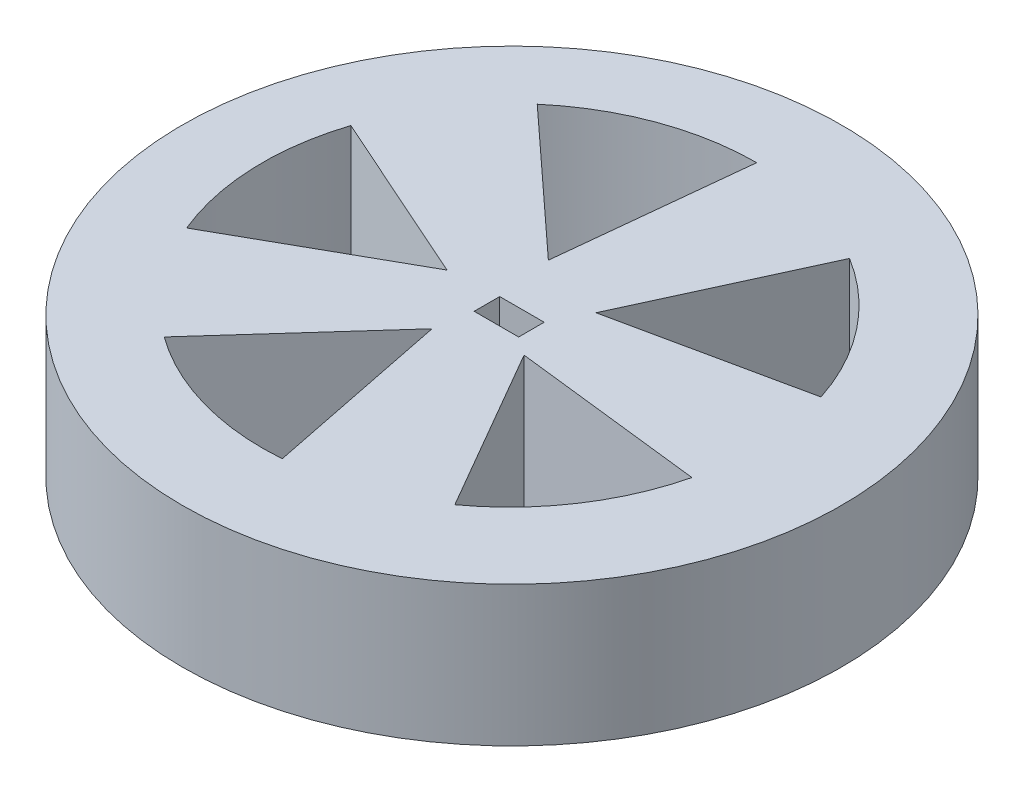
ISO-10303-21;
HEADER;
FILE_DESCRIPTION(('STEP AP214'),'2;1');
FILE_NAME('part.step','',(''),(''),'','','');
FILE_SCHEMA(('AUTOMOTIVE_DESIGN { 1 0 10303 214 1 1 1 1 }'));
ENDSEC;
DATA;
#1=APPLICATION_CONTEXT('core data for automotive mechanical design processes');
#2=APPLICATION_PROTOCOL_DEFINITION('international standard','automotive_design',2000,#1);
#3=PRODUCT_CONTEXT('',#1,'mechanical');
#4=PRODUCT('Part','Part','',(#3));
#5=PRODUCT_RELATED_PRODUCT_CATEGORY('part','',(#4));
#6=PRODUCT_DEFINITION_FORMATION('','',#4);
#7=PRODUCT_DEFINITION_CONTEXT('part definition',#1,'design');
#8=PRODUCT_DEFINITION('design','',#6,#7);
#9=PRODUCT_DEFINITION_SHAPE('','',#8);
#10=(LENGTH_UNIT() NAMED_UNIT(*) SI_UNIT(.MILLI.,.METRE.));
#11=(NAMED_UNIT(*) PLANE_ANGLE_UNIT() SI_UNIT($,.RADIAN.));
#12=(NAMED_UNIT(*) SI_UNIT($,.STERADIAN.) SOLID_ANGLE_UNIT());
#13=UNCERTAINTY_MEASURE_WITH_UNIT(LENGTH_MEASURE(1.E-05),#10,'distance_accuracy_value','');
#14=(GEOMETRIC_REPRESENTATION_CONTEXT(3) GLOBAL_UNCERTAINTY_ASSIGNED_CONTEXT((#13)) GLOBAL_UNIT_ASSIGNED_CONTEXT((#10,
#11,#12)) REPRESENTATION_CONTEXT('',''));
#15=CARTESIAN_POINT('',(0.,0.,0.));
#16=DIRECTION('',(0.,0.,1.));
#17=DIRECTION('',(1.,0.,0.));
#18=AXIS2_PLACEMENT_3D('',#15,#16,#17);
#19=CARTESIAN_POINT('',(1.17596206407572,17.,0.881971548056787));
#20=DIRECTION('',(0.,1.,0.));
#21=DIRECTION('',(0.,0.,1.));
#22=AXIS2_PLACEMENT_3D('',#19,#20,#21);
#23=PLANE('',#22);
#24=DIRECTION('',(-0.668654529701066,0.,0.743573210861073));
#25=VECTOR('',#24,1.);
#26=CARTESIAN_POINT('',(2.31752832242779,17.,2.08402587380381));
#27=LINE('',#26,#25);
#28=CARTESIAN_POINT('',(-2.24384736505578,17.,7.156476018428));
#29=VERTEX_POINT('',#28);
#30=CARTESIAN_POINT('',(-17.6335575687735,17.,24.2705098312489));
#31=VERTEX_POINT('',#30);
#32=EDGE_CURVE('E316',#29,#31,#27,.T.);
#33=ORIENTED_EDGE('',*,*,#32,.F.);
#34=DIRECTION('',(0.197039180270944,0.,0.980395614758733));
#35=VECTOR('',#34,1.);
#36=CARTESIAN_POINT('',(-3.5391931546343,17.,0.711304403560899));
#37=LINE('',#36,#35);
#38=CARTESIAN_POINT('',(2.329029809018,17.,29.9094570353377));
#39=VERTEX_POINT('',#38);
#40=EDGE_CURVE('E325',#29,#39,#37,.T.);
#41=ORIENTED_EDGE('',*,*,#40,.T.);
#42=CARTESIAN_POINT('',(0.,17.,0.));
#43=DIRECTION('',(0.,1.,0.));
#44=DIRECTION('',(0.,0.,1.));
#45=AXIS2_PLACEMENT_3D('',#42,#43,#44);
#46=CIRCLE('',#45,30.);
#47=EDGE_CURVE('E333',#31,#39,#46,.T.);
#48=ORIENTED_EDGE('',*,*,#47,.F.);
#49=EDGE_LOOP('',(#33,#41,#48));
#50=FACE_BOUND('',#49,.T.);
#51=DIRECTION('',(-0.913805760575352,0.,-0.406151488904452));
#52=VECTOR('',#51,1.);
#53=CARTESIAN_POINT('',(-1.26587075083312,17.,2.84809982446544));
#54=LINE('',#53,#52);
#55=CARTESIAN_POINT('',(-7.49960011962144,17.,0.0774470514224111));
#56=VERTEX_POINT('',#55);
#57=CARTESIAN_POINT('',(-28.5316954888547,17.,-9.27050983124824));
#58=VERTEX_POINT('',#57);
#59=EDGE_CURVE('E246',#56,#58,#54,.T.);
#60=ORIENTED_EDGE('',*,*,#59,.F.);
#61=DIRECTION('',(-0.871523182702066,0.,0.490354302533242));
#62=VECTOR('',#61,1.);
#63=CARTESIAN_POINT('',(-1.77016151923359,17.,-3.14616756326839));
#64=LINE('',#63,#62);
#65=CARTESIAN_POINT('',(-27.7258742209157,17.,11.457569492958));
#66=VERTEX_POINT('',#65);
#67=EDGE_CURVE('E301',#56,#66,#64,.T.);
#68=ORIENTED_EDGE('',*,*,#67,.T.);
#69=CARTESIAN_POINT('',(0.,17.,0.));
#70=DIRECTION('',(0.,1.,0.));
#71=DIRECTION('',(0.,0.,1.));
#72=AXIS2_PLACEMENT_3D('',#69,#70,#71);
#73=CIRCLE('',#72,30.);
#74=EDGE_CURVE('E309',#58,#66,#73,.T.);
#75=ORIENTED_EDGE('',*,*,#74,.F.);
#76=EDGE_LOOP('',(#60,#68,#75));
#77=FACE_BOUND('',#76,.T.);
#78=DIRECTION('',(0.500554534488517,0.,0.865705006340488));
#79=VECTOR('',#78,1.);
#80=CARTESIAN_POINT('',(2.69818202398449,17.,-1.56010100102118));
#81=LINE('',#80,#79);
#82=CARTESIAN_POINT('',(6.11282618245077,17.,4.34549836763939));
#83=VERTEX_POINT('',#82);
#84=CARTESIAN_POINT('',(17.633557568775,17.,24.2705098312478));
#85=VERTEX_POINT('',#84);
#86=EDGE_CURVE('E284',#83,#85,#81,.T.);
#87=ORIENTED_EDGE('',*,*,#86,.F.);
#88=DIRECTION('',(0.993300093224917,0.,0.115563509808985));
#89=VECTOR('',#88,1.);
#90=CARTESIAN_POINT('',(-0.417180143081486,17.,3.58577786101651));
#91=LINE('',#90,#89);
#92=CARTESIAN_POINT('',(29.1652938037007,17.,7.02749153993481));
#93=VERTEX_POINT('',#92);
#94=EDGE_CURVE('E277',#83,#93,#91,.T.);
#95=ORIENTED_EDGE('',*,*,#94,.T.);
#96=CARTESIAN_POINT('',(0.,17.,0.));
#97=DIRECTION('',(0.,1.,0.));
#98=DIRECTION('',(0.,0.,1.));
#99=AXIS2_PLACEMENT_3D('',#96,#97,#98);
#100=CIRCLE('',#99,30.);
#101=EDGE_CURVE('E286',#85,#93,#100,.T.);
#102=ORIENTED_EDGE('',*,*,#101,.F.);
#103=EDGE_LOOP('',(#87,#95,#102));
#104=FACE_BOUND('',#103,.T.);
#105=DIRECTION('',(0.978014245237851,0.,-0.208538092711709));
#106=VECTOR('',#105,1.);
#107=CARTESIAN_POINT('',(-0.649960123771487,17.,-3.04822131831735));
#108=LINE('',#107,#106);
#109=CARTESIAN_POINT('',(6.02178171313132,17.,-4.47081032916991));
#110=VERTEX_POINT('',#109);
#111=CARTESIAN_POINT('',(28.5316954888544,17.,-9.2705098312489));
#112=VERTEX_POINT('',#111);
#113=EDGE_CURVE('E258',#110,#112,#108,.T.);
#114=ORIENTED_EDGE('',*,*,#113,.F.);
#115=DIRECTION('',(0.416854038370512,0.,-0.90897343783754));
#116=VECTOR('',#115,1.);
#117=CARTESIAN_POINT('',(3.2813616467791,17.,1.50482819065441));
#118=LINE('',#117,#116);
#119=CARTESIAN_POINT('',(15.6961130535469,17.,-25.5662284080056));
#120=VERTEX_POINT('',#119);
#121=EDGE_CURVE('E251',#110,#120,#118,.T.);
#122=ORIENTED_EDGE('',*,*,#121,.T.);
#123=CARTESIAN_POINT('',(0.,17.,0.));
#124=DIRECTION('',(0.,1.,0.));
#125=DIRECTION('',(0.,0.,1.));
#126=AXIS2_PLACEMENT_3D('',#123,#124,#125);
#127=CIRCLE('',#126,30.);
#128=EDGE_CURVE('E260',#112,#120,#127,.T.);
#129=ORIENTED_EDGE('',*,*,#128,.F.);
#130=EDGE_LOOP('',(#114,#122,#129));
#131=FACE_BOUND('',#130,.T.);
#132=DIRECTION('',(0.10389151055005,0.,-0.994588635585401));
#133=VECTOR('',#132,1.);
#134=CARTESIAN_POINT('',(-3.09987947180642,17.,-0.323803378931136));
#135=LINE('',#134,#133);
#136=CARTESIAN_POINT('',(-2.39116041090241,17.,-7.10861110832017));
#137=VERTEX_POINT('',#136);
#138=CARTESIAN_POINT('',(0.,17.,-30.));
#139=VERTEX_POINT('',#138);
#140=EDGE_CURVE('E268',#137,#139,#135,.T.);
#141=ORIENTED_EDGE('',*,*,#140,.F.);
#142=DIRECTION('',(-0.735670129164273,0.,-0.677339989263459));
#143=VECTOR('',#142,1.);
#144=CARTESIAN_POINT('',(2.44517317017114,17.,-2.65574289196314));
#145=LINE('',#144,#143);
#146=CARTESIAN_POINT('',(-19.4645624453471,17.,-22.8282896602261));
#147=VERTEX_POINT('',#146);
#148=EDGE_CURVE('E347',#137,#147,#145,.T.);
#149=ORIENTED_EDGE('',*,*,#148,.T.);
#150=CARTESIAN_POINT('',(0.,17.,0.));
#151=DIRECTION('',(0.,1.,0.));
#152=DIRECTION('',(0.,0.,1.));
#153=AXIS2_PLACEMENT_3D('',#150,#151,#152);
#154=CIRCLE('',#153,30.);
#155=EDGE_CURVE('E355',#139,#147,#154,.T.);
#156=ORIENTED_EDGE('',*,*,#155,.F.);
#157=EDGE_LOOP('',(#141,#149,#156));
#158=FACE_BOUND('',#157,.T.);
#159=CARTESIAN_POINT('',(1.17596206407572,17.,0.881971548056787));
#160=DIRECTION('',(0.,1.,0.));
#161=DIRECTION('',(0.,0.,1.));
#162=AXIS2_PLACEMENT_3D('',#159,#160,#161);
#163=CIRCLE('',#162,40.);
#164=CARTESIAN_POINT('',(1.17596206407572,17.,40.8819715480568));
#165=VERTEX_POINT('',#164);
#166=EDGE_CURVE('E14',#165,#165,#163,.T.);
#167=ORIENTED_EDGE('',*,*,#166,.T.);
#168=EDGE_LOOP('',(#167));
#169=FACE_BOUND('',#168,.T.);
#170=DIRECTION('',(0.,0.,1.));
#171=VECTOR('',#170,1.);
#172=CARTESIAN_POINT('',(3.87646736413946,17.,0.881971548056787));
#173=LINE('',#172,#171);
#174=CARTESIAN_POINT('',(3.87646736413946,17.,-0.332465206081998));
#175=VERTEX_POINT('',#174);
#176=CARTESIAN_POINT('',(3.87646736413946,17.,2.767534793918));
#177=VERTEX_POINT('',#176);
#178=EDGE_CURVE('E243',#175,#177,#173,.T.);
#179=ORIENTED_EDGE('',*,*,#178,.T.);
#180=DIRECTION('',(-1.,0.,0.));
#181=VECTOR('',#180,1.);
#182=CARTESIAN_POINT('',(1.17596206407572,17.,2.767534793918));
#183=LINE('',#182,#181);
#184=CARTESIAN_POINT('',(-1.52353263586054,17.,2.767534793918));
#185=VERTEX_POINT('',#184);
#186=EDGE_CURVE('E214',#177,#185,#183,.T.);
#187=ORIENTED_EDGE('',*,*,#186,.T.);
#188=DIRECTION('',(0.,0.,1.));
#189=VECTOR('',#188,1.);
#190=CARTESIAN_POINT('',(-1.52353263586054,17.,0.881971548056787));
#191=LINE('',#190,#189);
#192=CARTESIAN_POINT('',(-1.52353263586054,17.,-0.332465206081998));
#193=VERTEX_POINT('',#192);
#194=EDGE_CURVE('E217',#193,#185,#191,.T.);
#195=ORIENTED_EDGE('',*,*,#194,.F.);
#196=DIRECTION('',(-1.,0.,0.));
#197=VECTOR('',#196,1.);
#198=CARTESIAN_POINT('',(1.17596206407572,17.,-0.332465206081998));
#199=LINE('',#198,#197);
#200=EDGE_CURVE('E241',#175,#193,#199,.T.);
#201=ORIENTED_EDGE('',*,*,#200,.F.);
#202=EDGE_LOOP('',(#179,#187,#195,#201));
#203=FACE_BOUND('',#202,.T.);
#204=ADVANCED_FACE('F80',(#50,#77,#104,#131,#158,#169,#203),#23,.T.);
#205=CARTESIAN_POINT('',(1.17596206407572,0.,0.881971548056787));
#206=DIRECTION('',(0.,1.,0.));
#207=DIRECTION('',(0.,0.,1.));
#208=AXIS2_PLACEMENT_3D('',#205,#206,#207);
#209=PLANE('',#208);
#210=CARTESIAN_POINT('',(1.17596206407572,0.,0.881971548056787));
#211=DIRECTION('',(0.,1.,0.));
#212=DIRECTION('',(0.,0.,1.));
#213=AXIS2_PLACEMENT_3D('',#210,#211,#212);
#214=CIRCLE('',#213,40.);
#215=CARTESIAN_POINT('',(1.17596206407572,0.,40.8819715480568));
#216=VERTEX_POINT('',#215);
#217=EDGE_CURVE('E84',#216,#216,#214,.T.);
#218=ORIENTED_EDGE('',*,*,#217,.F.);
#219=EDGE_LOOP('',(#218));
#220=FACE_BOUND('',#219,.T.);
#221=DIRECTION('',(-0.735670129164273,0.,-0.677339989263459));
#222=VECTOR('',#221,1.);
#223=CARTESIAN_POINT('',(2.44517317017114,0.,-2.65574289196314));
#224=LINE('',#223,#222);
#225=CARTESIAN_POINT('',(-2.39116041090241,0.,-7.10861110832017));
#226=VERTEX_POINT('',#225);
#227=CARTESIAN_POINT('',(-19.4645624453471,0.,-22.8282896602261));
#228=VERTEX_POINT('',#227);
#229=EDGE_CURVE('E350',#226,#228,#224,.T.);
#230=ORIENTED_EDGE('',*,*,#229,.F.);
#231=DIRECTION('',(0.10389151055005,0.,-0.994588635585401));
#232=VECTOR('',#231,1.);
#233=CARTESIAN_POINT('',(-3.09987947180642,0.,-0.323803378931136));
#234=LINE('',#233,#232);
#235=CARTESIAN_POINT('',(0.,0.,-30.));
#236=VERTEX_POINT('',#235);
#237=EDGE_CURVE('E343',#226,#236,#234,.T.);
#238=ORIENTED_EDGE('',*,*,#237,.T.);
#239=CARTESIAN_POINT('',(0.,0.,0.));
#240=DIRECTION('',(0.,1.,0.));
#241=DIRECTION('',(0.,0.,1.));
#242=AXIS2_PLACEMENT_3D('',#239,#240,#241);
#243=CIRCLE('',#242,30.);
#244=EDGE_CURVE('E346',#236,#228,#243,.T.);
#245=ORIENTED_EDGE('',*,*,#244,.T.);
#246=EDGE_LOOP('',(#230,#238,#245));
#247=FACE_BOUND('',#246,.T.);
#248=DIRECTION('',(0.416854038370512,0.,-0.90897343783754));
#249=VECTOR('',#248,1.);
#250=CARTESIAN_POINT('',(3.2813616467791,0.,1.50482819065441));
#251=LINE('',#250,#249);
#252=CARTESIAN_POINT('',(6.02178171313132,0.,-4.47081032916991));
#253=VERTEX_POINT('',#252);
#254=CARTESIAN_POINT('',(15.6961130535465,0.,-25.5662284080051));
#255=VERTEX_POINT('',#254);
#256=EDGE_CURVE('E254',#253,#255,#251,.T.);
#257=ORIENTED_EDGE('',*,*,#256,.F.);
#258=DIRECTION('',(0.978014245237851,0.,-0.208538092711709));
#259=VECTOR('',#258,1.);
#260=CARTESIAN_POINT('',(-0.649960123771487,0.,-3.04822131831735));
#261=LINE('',#260,#259);
#262=CARTESIAN_POINT('',(28.5316954888548,0.,-9.27050983124902));
#263=VERTEX_POINT('',#262);
#264=EDGE_CURVE('E247',#253,#263,#261,.T.);
#265=ORIENTED_EDGE('',*,*,#264,.T.);
#266=CARTESIAN_POINT('',(0.,0.,0.));
#267=DIRECTION('',(0.,1.,0.));
#268=DIRECTION('',(0.,0.,1.));
#269=AXIS2_PLACEMENT_3D('',#266,#267,#268);
#270=CIRCLE('',#269,30.);
#271=EDGE_CURVE('E250',#263,#255,#270,.T.);
#272=ORIENTED_EDGE('',*,*,#271,.T.);
#273=EDGE_LOOP('',(#257,#265,#272));
#274=FACE_BOUND('',#273,.T.);
#275=DIRECTION('',(0.993300093224917,0.,0.115563509808985));
#276=VECTOR('',#275,1.);
#277=CARTESIAN_POINT('',(-0.417180143081486,0.,3.58577786101651));
#278=LINE('',#277,#276);
#279=CARTESIAN_POINT('',(6.11282618245077,0.,4.34549836763939));
#280=VERTEX_POINT('',#279);
#281=CARTESIAN_POINT('',(29.1652938037001,0.,7.02749153993466));
#282=VERTEX_POINT('',#281);
#283=EDGE_CURVE('E280',#280,#282,#278,.T.);
#284=ORIENTED_EDGE('',*,*,#283,.F.);
#285=DIRECTION('',(0.500554534488517,0.,0.865705006340488));
#286=VECTOR('',#285,1.);
#287=CARTESIAN_POINT('',(2.69818202398449,0.,-1.56010100102118));
#288=LINE('',#287,#286);
#289=CARTESIAN_POINT('',(17.633557568775,0.,24.2705098312478));
#290=VERTEX_POINT('',#289);
#291=EDGE_CURVE('E273',#280,#290,#288,.T.);
#292=ORIENTED_EDGE('',*,*,#291,.T.);
#293=CARTESIAN_POINT('',(0.,0.,0.));
#294=DIRECTION('',(0.,1.,0.));
#295=DIRECTION('',(0.,0.,1.));
#296=AXIS2_PLACEMENT_3D('',#293,#294,#295);
#297=CIRCLE('',#296,30.);
#298=EDGE_CURVE('E276',#290,#282,#297,.T.);
#299=ORIENTED_EDGE('',*,*,#298,.T.);
#300=EDGE_LOOP('',(#284,#292,#299));
#301=FACE_BOUND('',#300,.T.);
#302=DIRECTION('',(-0.871523182702066,0.,0.490354302533242));
#303=VECTOR('',#302,1.);
#304=CARTESIAN_POINT('',(-1.77016151923359,0.,-3.14616756326839));
#305=LINE('',#304,#303);
#306=CARTESIAN_POINT('',(-7.49960011962144,0.,0.0774470514224111));
#307=VERTEX_POINT('',#306);
#308=CARTESIAN_POINT('',(-27.7258742209157,0.,11.457569492958));
#309=VERTEX_POINT('',#308);
#310=EDGE_CURVE('E304',#307,#309,#305,.T.);
#311=ORIENTED_EDGE('',*,*,#310,.F.);
#312=DIRECTION('',(-0.913805760575352,0.,-0.406151488904452));
#313=VECTOR('',#312,1.);
#314=CARTESIAN_POINT('',(-1.26587075083312,0.,2.84809982446544));
#315=LINE('',#314,#313);
#316=CARTESIAN_POINT('',(-28.5316954888541,0.,-9.27050983124806));
#317=VERTEX_POINT('',#316);
#318=EDGE_CURVE('E297',#307,#317,#315,.T.);
#319=ORIENTED_EDGE('',*,*,#318,.T.);
#320=CARTESIAN_POINT('',(0.,0.,0.));
#321=DIRECTION('',(0.,1.,0.));
#322=DIRECTION('',(0.,0.,1.));
#323=AXIS2_PLACEMENT_3D('',#320,#321,#322);
#324=CIRCLE('',#323,30.);
#325=EDGE_CURVE('E300',#317,#309,#324,.T.);
#326=ORIENTED_EDGE('',*,*,#325,.T.);
#327=EDGE_LOOP('',(#311,#319,#326));
#328=FACE_BOUND('',#327,.T.);
#329=DIRECTION('',(0.197039180270944,0.,0.980395614758733));
#330=VECTOR('',#329,1.);
#331=CARTESIAN_POINT('',(-3.5391931546343,0.,0.711304403560899));
#332=LINE('',#331,#330);
#333=CARTESIAN_POINT('',(-2.24384736505578,0.,7.156476018428));
#334=VERTEX_POINT('',#333);
#335=CARTESIAN_POINT('',(2.32902980901799,0.,29.9094570353376));
#336=VERTEX_POINT('',#335);
#337=EDGE_CURVE('E328',#334,#336,#332,.T.);
#338=ORIENTED_EDGE('',*,*,#337,.F.);
#339=DIRECTION('',(-0.668654529701066,0.,0.743573210861073));
#340=VECTOR('',#339,1.);
#341=CARTESIAN_POINT('',(2.31752832242779,0.,2.08402587380381));
#342=LINE('',#341,#340);
#343=CARTESIAN_POINT('',(-17.6335575687732,0.,24.2705098312484));
#344=VERTEX_POINT('',#343);
#345=EDGE_CURVE('E321',#334,#344,#342,.T.);
#346=ORIENTED_EDGE('',*,*,#345,.T.);
#347=CARTESIAN_POINT('',(0.,0.,0.));
#348=DIRECTION('',(0.,1.,0.));
#349=DIRECTION('',(0.,0.,1.));
#350=AXIS2_PLACEMENT_3D('',#347,#348,#349);
#351=CIRCLE('',#350,30.);
#352=EDGE_CURVE('E324',#344,#336,#351,.T.);
#353=ORIENTED_EDGE('',*,*,#352,.T.);
#354=EDGE_LOOP('',(#338,#346,#353));
#355=FACE_BOUND('',#354,.T.);
#356=DIRECTION('',(1.,0.,0.));
#357=VECTOR('',#356,1.);
#358=CARTESIAN_POINT('',(-1.52353263586054,0.,2.767534793918));
#359=LINE('',#358,#357);
#360=CARTESIAN_POINT('',(-1.52353263586054,0.,2.767534793918));
#361=VERTEX_POINT('',#360);
#362=CARTESIAN_POINT('',(3.87646736413946,0.,2.767534793918));
#363=VERTEX_POINT('',#362);
#364=EDGE_CURVE('E103',#361,#363,#359,.T.);
#365=ORIENTED_EDGE('',*,*,#364,.T.);
#366=DIRECTION('',(0.,0.,-1.));
#367=VECTOR('',#366,1.);
#368=CARTESIAN_POINT('',(3.87646736413946,0.,2.767534793918));
#369=LINE('',#368,#367);
#370=CARTESIAN_POINT('',(3.87646736413946,0.,-0.332465206081998));
#371=VERTEX_POINT('',#370);
#372=EDGE_CURVE('E221',#363,#371,#369,.T.);
#373=ORIENTED_EDGE('',*,*,#372,.T.);
#374=DIRECTION('',(1.,0.,0.));
#375=VECTOR('',#374,1.);
#376=CARTESIAN_POINT('',(-1.52353263586054,0.,-0.332465206081998));
#377=LINE('',#376,#375);
#378=CARTESIAN_POINT('',(-1.52353263586054,0.,-0.332465206081998));
#379=VERTEX_POINT('',#378);
#380=EDGE_CURVE('E227',#379,#371,#377,.T.);
#381=ORIENTED_EDGE('',*,*,#380,.F.);
#382=DIRECTION('',(0.,0.,-1.));
#383=VECTOR('',#382,1.);
#384=CARTESIAN_POINT('',(-1.52353263586054,0.,2.767534793918));
#385=LINE('',#384,#383);
#386=EDGE_CURVE('E231',#361,#379,#385,.T.);
#387=ORIENTED_EDGE('',*,*,#386,.F.);
#388=EDGE_LOOP('',(#365,#373,#381,#387));
#389=FACE_BOUND('',#388,.T.);
#390=ADVANCED_FACE('F230',(#220,#247,#274,#301,#328,#355,#389),#209,.F.);
#391=CARTESIAN_POINT('',(1.17596206407572,17.,0.881971548056787));
#392=DIRECTION('',(0.,-1.,0.));
#393=DIRECTION('',(0.,0.,-1.));
#394=AXIS2_PLACEMENT_3D('',#391,#392,#393);
#395=CYLINDRICAL_SURFACE('',#394,40.);
#396=ORIENTED_EDGE('',*,*,#166,.F.);
#397=EDGE_LOOP('',(#396));
#398=FACE_BOUND('',#397,.T.);
#399=ORIENTED_EDGE('',*,*,#217,.T.);
#400=EDGE_LOOP('',(#399));
#401=FACE_BOUND('',#400,.T.);
#402=ADVANCED_FACE('F82',(#398,#401),#395,.T.);
#403=CARTESIAN_POINT('',(-3.09987947180642,0.,-0.323803378931136));
#404=DIRECTION('',(0.9945886355854,0.,0.10389151055005));
#405=DIRECTION('',(0.10389151055005,0.,-0.994588635585401));
#406=AXIS2_PLACEMENT_3D('',#403,#404,#405);
#407=PLANE('',#406);
#408=ORIENTED_EDGE('',*,*,#140,.T.);
#409=DIRECTION('',(0.,1.,0.));
#410=VECTOR('',#409,1.);
#411=CARTESIAN_POINT('',(0.,0.,-30.));
#412=LINE('',#411,#410);
#413=EDGE_CURVE('E353',#236,#139,#412,.T.);
#414=ORIENTED_EDGE('',*,*,#413,.F.);
#415=ORIENTED_EDGE('',*,*,#237,.F.);
#416=DIRECTION('',(0.,1.,0.));
#417=VECTOR('',#416,1.);
#418=CARTESIAN_POINT('',(-2.39116041090241,0.,-7.10861110832017));
#419=LINE('',#418,#417);
#420=EDGE_CURVE('E360',#226,#137,#419,.T.);
#421=ORIENTED_EDGE('',*,*,#420,.T.);
#422=EDGE_LOOP('',(#408,#414,#415,#421));
#423=FACE_BOUND('',#422,.T.);
#424=ADVANCED_FACE('F380',(#423),#407,.F.);
#425=CARTESIAN_POINT('',(2.44517317017114,0.,-2.65574289196314));
#426=DIRECTION('',(0.677339989263459,0.,-0.735670129164273));
#427=DIRECTION('',(-0.735670129164273,0.,-0.677339989263459));
#428=AXIS2_PLACEMENT_3D('',#425,#426,#427);
#429=PLANE('',#428);
#430=ORIENTED_EDGE('',*,*,#148,.F.);
#431=ORIENTED_EDGE('',*,*,#420,.F.);
#432=ORIENTED_EDGE('',*,*,#229,.T.);
#433=DIRECTION('',(0.,1.,0.));
#434=VECTOR('',#433,1.);
#435=CARTESIAN_POINT('',(-19.4645624453471,0.,-22.8282896602261));
#436=LINE('',#435,#434);
#437=EDGE_CURVE('E362',#228,#147,#436,.T.);
#438=ORIENTED_EDGE('',*,*,#437,.T.);
#439=EDGE_LOOP('',(#430,#431,#432,#438));
#440=FACE_BOUND('',#439,.T.);
#441=ADVANCED_FACE('F376',(#440),#429,.T.);
#442=CARTESIAN_POINT('',(0.,0.,0.));
#443=DIRECTION('',(0.,1.,0.));
#444=DIRECTION('',(0.,0.,1.));
#445=AXIS2_PLACEMENT_3D('',#442,#443,#444);
#446=CYLINDRICAL_SURFACE('',#445,30.);
#447=ORIENTED_EDGE('',*,*,#155,.T.);
#448=ORIENTED_EDGE('',*,*,#437,.F.);
#449=ORIENTED_EDGE('',*,*,#244,.F.);
#450=ORIENTED_EDGE('',*,*,#413,.T.);
#451=EDGE_LOOP('',(#447,#448,#449,#450));
#452=FACE_BOUND('',#451,.T.);
#453=ADVANCED_FACE('F368',(#452),#446,.F.);
#454=CARTESIAN_POINT('',(-0.649960123771487,0.,-3.04822131831735));
#455=DIRECTION('',(0.208538092711709,0.,0.978014245237851));
#456=DIRECTION('',(0.978014245237851,0.,-0.208538092711709));
#457=AXIS2_PLACEMENT_3D('',#454,#455,#456);
#458=PLANE('',#457);
#459=ORIENTED_EDGE('',*,*,#113,.T.);
#460=DIRECTION('',(0.,1.,0.));
#461=VECTOR('',#460,1.);
#462=CARTESIAN_POINT('',(28.5316954888548,0.,-9.27050983124902));
#463=LINE('',#462,#461);
#464=EDGE_CURVE('E257',#263,#112,#463,.T.);
#465=ORIENTED_EDGE('',*,*,#464,.F.);
#466=ORIENTED_EDGE('',*,*,#264,.F.);
#467=DIRECTION('',(0.,1.,0.));
#468=VECTOR('',#467,1.);
#469=CARTESIAN_POINT('',(6.02178171313132,0.,-4.47081032916991));
#470=LINE('',#469,#468);
#471=EDGE_CURVE('E266',#253,#110,#470,.T.);
#472=ORIENTED_EDGE('',*,*,#471,.T.);
#473=EDGE_LOOP('',(#459,#465,#466,#472));
#474=FACE_BOUND('',#473,.T.);
#475=ADVANCED_FACE('F410',(#474),#458,.F.);
#476=CARTESIAN_POINT('',(3.2813616467791,0.,1.50482819065441));
#477=DIRECTION('',(0.90897343783754,0.,0.416854038370512));
#478=DIRECTION('',(0.416854038370512,0.,-0.90897343783754));
#479=AXIS2_PLACEMENT_3D('',#476,#477,#478);
#480=PLANE('',#479);
#481=ORIENTED_EDGE('',*,*,#121,.F.);
#482=ORIENTED_EDGE('',*,*,#471,.F.);
#483=ORIENTED_EDGE('',*,*,#256,.T.);
#484=DIRECTION('',(0.,1.,0.));
#485=VECTOR('',#484,1.);
#486=CARTESIAN_POINT('',(15.6961130535469,0.,-25.5662284080056));
#487=LINE('',#486,#485);
#488=EDGE_CURVE('E269',#255,#120,#487,.T.);
#489=ORIENTED_EDGE('',*,*,#488,.T.);
#490=EDGE_LOOP('',(#481,#482,#483,#489));
#491=FACE_BOUND('',#490,.T.);
#492=ADVANCED_FACE('F418',(#491),#480,.T.);
#493=CARTESIAN_POINT('',(0.,0.,0.));
#494=DIRECTION('',(0.,1.,0.));
#495=DIRECTION('',(0.,0.,1.));
#496=AXIS2_PLACEMENT_3D('',#493,#494,#495);
#497=CYLINDRICAL_SURFACE('',#496,30.);
#498=ORIENTED_EDGE('',*,*,#128,.T.);
#499=ORIENTED_EDGE('',*,*,#488,.F.);
#500=ORIENTED_EDGE('',*,*,#271,.F.);
#501=ORIENTED_EDGE('',*,*,#464,.T.);
#502=EDGE_LOOP('',(#498,#499,#500,#501));
#503=FACE_BOUND('',#502,.T.);
#504=ADVANCED_FACE('F414',(#503),#497,.F.);
#505=CARTESIAN_POINT('',(2.69818202398449,0.,-1.56010100102118));
#506=DIRECTION('',(-0.865705006340488,0.,0.500554534488517));
#507=DIRECTION('',(0.500554534488517,0.,0.865705006340488));
#508=AXIS2_PLACEMENT_3D('',#505,#506,#507);
#509=PLANE('',#508);
#510=ORIENTED_EDGE('',*,*,#86,.T.);
#511=DIRECTION('',(0.,1.,0.));
#512=VECTOR('',#511,1.);
#513=CARTESIAN_POINT('',(17.633557568775,0.,24.2705098312478));
#514=LINE('',#513,#512);
#515=EDGE_CURVE('E283',#290,#85,#514,.T.);
#516=ORIENTED_EDGE('',*,*,#515,.F.);
#517=ORIENTED_EDGE('',*,*,#291,.F.);
#518=DIRECTION('',(0.,1.,0.));
#519=VECTOR('',#518,1.);
#520=CARTESIAN_POINT('',(6.11282618245077,0.,4.34549836763939));
#521=LINE('',#520,#519);
#522=EDGE_CURVE('E261',#280,#83,#521,.T.);
#523=ORIENTED_EDGE('',*,*,#522,.T.);
#524=EDGE_LOOP('',(#510,#516,#517,#523));
#525=FACE_BOUND('',#524,.T.);
#526=ADVANCED_FACE('F425',(#525),#509,.F.);
#527=CARTESIAN_POINT('',(-0.417180143081486,0.,3.58577786101651));
#528=DIRECTION('',(-0.115563509808985,0.,0.993300093224917));
#529=DIRECTION('',(0.993300093224917,0.,0.115563509808985));
#530=AXIS2_PLACEMENT_3D('',#527,#528,#529);
#531=PLANE('',#530);
#532=ORIENTED_EDGE('',*,*,#94,.F.);
#533=ORIENTED_EDGE('',*,*,#522,.F.);
#534=ORIENTED_EDGE('',*,*,#283,.T.);
#535=DIRECTION('',(0.,1.,0.));
#536=VECTOR('',#535,1.);
#537=CARTESIAN_POINT('',(29.1652938037007,0.,7.02749153993481));
#538=LINE('',#537,#536);
#539=EDGE_CURVE('E293',#282,#93,#538,.T.);
#540=ORIENTED_EDGE('',*,*,#539,.T.);
#541=EDGE_LOOP('',(#532,#533,#534,#540));
#542=FACE_BOUND('',#541,.T.);
#543=ADVANCED_FACE('F431',(#542),#531,.T.);
#544=CARTESIAN_POINT('',(0.,0.,0.));
#545=DIRECTION('',(0.,1.,0.));
#546=DIRECTION('',(0.,0.,1.));
#547=AXIS2_PLACEMENT_3D('',#544,#545,#546);
#548=CYLINDRICAL_SURFACE('',#547,30.);
#549=ORIENTED_EDGE('',*,*,#101,.T.);
#550=ORIENTED_EDGE('',*,*,#539,.F.);
#551=ORIENTED_EDGE('',*,*,#298,.F.);
#552=ORIENTED_EDGE('',*,*,#515,.T.);
#553=EDGE_LOOP('',(#549,#550,#551,#552));
#554=FACE_BOUND('',#553,.T.);
#555=ADVANCED_FACE('F434',(#554),#548,.F.);
#556=CARTESIAN_POINT('',(-1.26587075083312,0.,2.84809982446544));
#557=DIRECTION('',(0.406151488904452,0.,-0.913805760575351));
#558=DIRECTION('',(-0.913805760575352,0.,-0.406151488904452));
#559=AXIS2_PLACEMENT_3D('',#556,#557,#558);
#560=PLANE('',#559);
#561=ORIENTED_EDGE('',*,*,#59,.T.);
#562=DIRECTION('',(0.,1.,0.));
#563=VECTOR('',#562,1.);
#564=CARTESIAN_POINT('',(-28.5316954888541,0.,-9.27050983124806));
#565=LINE('',#564,#563);
#566=EDGE_CURVE('E307',#317,#58,#565,.T.);
#567=ORIENTED_EDGE('',*,*,#566,.F.);
#568=ORIENTED_EDGE('',*,*,#318,.F.);
#569=DIRECTION('',(0.,1.,0.));
#570=VECTOR('',#569,1.);
#571=CARTESIAN_POINT('',(-7.49960011962144,0.,0.0774470514224111));
#572=LINE('',#571,#570);
#573=EDGE_CURVE('E314',#307,#56,#572,.T.);
#574=ORIENTED_EDGE('',*,*,#573,.T.);
#575=EDGE_LOOP('',(#561,#567,#568,#574));
#576=FACE_BOUND('',#575,.T.);
#577=ADVANCED_FACE('F438',(#576),#560,.F.);
#578=CARTESIAN_POINT('',(-1.77016151923359,0.,-3.14616756326839));
#579=DIRECTION('',(-0.490354302533242,0.,-0.871523182702066));
#580=DIRECTION('',(-0.871523182702065,0.,0.490354302533242));
#581=AXIS2_PLACEMENT_3D('',#578,#579,#580);
#582=PLANE('',#581);
#583=ORIENTED_EDGE('',*,*,#67,.F.);
#584=ORIENTED_EDGE('',*,*,#573,.F.);
#585=ORIENTED_EDGE('',*,*,#310,.T.);
#586=DIRECTION('',(0.,1.,0.));
#587=VECTOR('',#586,1.);
#588=CARTESIAN_POINT('',(-27.7258742209157,0.,11.457569492958));
#589=LINE('',#588,#587);
#590=EDGE_CURVE('E317',#309,#66,#589,.T.);
#591=ORIENTED_EDGE('',*,*,#590,.T.);
#592=EDGE_LOOP('',(#583,#584,#585,#591));
#593=FACE_BOUND('',#592,.T.);
#594=ADVANCED_FACE('F443',(#593),#582,.T.);
#595=CARTESIAN_POINT('',(0.,0.,0.));
#596=DIRECTION('',(0.,1.,0.));
#597=DIRECTION('',(0.,0.,1.));
#598=AXIS2_PLACEMENT_3D('',#595,#596,#597);
#599=CYLINDRICAL_SURFACE('',#598,30.);
#600=ORIENTED_EDGE('',*,*,#74,.T.);
#601=ORIENTED_EDGE('',*,*,#590,.F.);
#602=ORIENTED_EDGE('',*,*,#325,.F.);
#603=ORIENTED_EDGE('',*,*,#566,.T.);
#604=EDGE_LOOP('',(#600,#601,#602,#603));
#605=FACE_BOUND('',#604,.T.);
#606=ADVANCED_FACE('F446',(#605),#599,.F.);
#607=CARTESIAN_POINT('',(2.31752832242779,0.,2.08402587380381));
#608=DIRECTION('',(-0.743573210861073,0.,-0.668654529701066));
#609=DIRECTION('',(-0.668654529701066,0.,0.743573210861073));
#610=AXIS2_PLACEMENT_3D('',#607,#608,#609);
#611=PLANE('',#610);
#612=ORIENTED_EDGE('',*,*,#32,.T.);
#613=DIRECTION('',(0.,1.,0.));
#614=VECTOR('',#613,1.);
#615=CARTESIAN_POINT('',(-17.6335575687732,0.,24.2705098312484));
#616=LINE('',#615,#614);
#617=EDGE_CURVE('E331',#344,#31,#616,.T.);
#618=ORIENTED_EDGE('',*,*,#617,.F.);
#619=ORIENTED_EDGE('',*,*,#345,.F.);
#620=DIRECTION('',(0.,1.,0.));
#621=VECTOR('',#620,1.);
#622=CARTESIAN_POINT('',(-2.24384736505578,0.,7.156476018428));
#623=LINE('',#622,#621);
#624=EDGE_CURVE('E287',#334,#29,#623,.T.);
#625=ORIENTED_EDGE('',*,*,#624,.T.);
#626=EDGE_LOOP('',(#612,#618,#619,#625));
#627=FACE_BOUND('',#626,.T.);
#628=ADVANCED_FACE('F450',(#627),#611,.F.);
#629=CARTESIAN_POINT('',(-3.5391931546343,0.,0.711304403560899));
#630=DIRECTION('',(-0.980395614758733,0.,0.197039180270944));
#631=DIRECTION('',(0.197039180270944,0.,0.980395614758733));
#632=AXIS2_PLACEMENT_3D('',#629,#630,#631);
#633=PLANE('',#632);
#634=ORIENTED_EDGE('',*,*,#40,.F.);
#635=ORIENTED_EDGE('',*,*,#624,.F.);
#636=ORIENTED_EDGE('',*,*,#337,.T.);
#637=DIRECTION('',(0.,1.,0.));
#638=VECTOR('',#637,1.);
#639=CARTESIAN_POINT('',(2.329029809018,0.,29.9094570353377));
#640=LINE('',#639,#638);
#641=EDGE_CURVE('E339',#336,#39,#640,.T.);
#642=ORIENTED_EDGE('',*,*,#641,.T.);
#643=EDGE_LOOP('',(#634,#635,#636,#642));
#644=FACE_BOUND('',#643,.T.);
#645=ADVANCED_FACE('F455',(#644),#633,.T.);
#646=CARTESIAN_POINT('',(0.,0.,0.));
#647=DIRECTION('',(0.,1.,0.));
#648=DIRECTION('',(0.,0.,1.));
#649=AXIS2_PLACEMENT_3D('',#646,#647,#648);
#650=CYLINDRICAL_SURFACE('',#649,30.);
#651=ORIENTED_EDGE('',*,*,#47,.T.);
#652=ORIENTED_EDGE('',*,*,#641,.F.);
#653=ORIENTED_EDGE('',*,*,#352,.F.);
#654=ORIENTED_EDGE('',*,*,#617,.T.);
#655=EDGE_LOOP('',(#651,#652,#653,#654));
#656=FACE_BOUND('',#655,.T.);
#657=ADVANCED_FACE('F458',(#656),#650,.F.);
#658=CARTESIAN_POINT('',(-1.52353263586054,20.,2.767534793918));
#659=DIRECTION('',(0.,0.,-1.));
#660=DIRECTION('',(-1.,0.,0.));
#661=AXIS2_PLACEMENT_3D('',#658,#659,#660);
#662=PLANE('',#661);
#663=DIRECTION('',(0.,-1.,0.));
#664=VECTOR('',#663,1.);
#665=CARTESIAN_POINT('',(3.87646736413946,20.,2.767534793918));
#666=LINE('',#665,#664);
#667=EDGE_CURVE('E210',#177,#363,#666,.T.);
#668=ORIENTED_EDGE('',*,*,#667,.T.);
#669=ORIENTED_EDGE('',*,*,#364,.F.);
#670=DIRECTION('',(0.,-1.,0.));
#671=VECTOR('',#670,1.);
#672=CARTESIAN_POINT('',(-1.52353263586054,20.,2.767534793918));
#673=LINE('',#672,#671);
#674=EDGE_CURVE('E236',#185,#361,#673,.T.);
#675=ORIENTED_EDGE('',*,*,#674,.F.);
#676=ORIENTED_EDGE('',*,*,#186,.F.);
#677=EDGE_LOOP('',(#668,#669,#675,#676));
#678=FACE_BOUND('',#677,.T.);
#679=ADVANCED_FACE('F212',(#678),#662,.T.);
#680=CARTESIAN_POINT('',(3.87646736413946,20.,2.767534793918));
#681=DIRECTION('',(-1.,0.,0.));
#682=DIRECTION('',(0.,0.,1.));
#683=AXIS2_PLACEMENT_3D('',#680,#681,#682);
#684=PLANE('',#683);
#685=DIRECTION('',(0.,-1.,0.));
#686=VECTOR('',#685,1.);
#687=CARTESIAN_POINT('',(3.87646736413946,20.,-0.332465206081998));
#688=LINE('',#687,#686);
#689=EDGE_CURVE('E218',#175,#371,#688,.T.);
#690=ORIENTED_EDGE('',*,*,#689,.T.);
#691=ORIENTED_EDGE('',*,*,#372,.F.);
#692=ORIENTED_EDGE('',*,*,#667,.F.);
#693=ORIENTED_EDGE('',*,*,#178,.F.);
#694=EDGE_LOOP('',(#690,#691,#692,#693));
#695=FACE_BOUND('',#694,.T.);
#696=ADVANCED_FACE('F222',(#695),#684,.T.);
#697=CARTESIAN_POINT('',(-1.52353263586054,20.,-0.332465206081998));
#698=DIRECTION('',(0.,0.,-1.));
#699=DIRECTION('',(-1.,0.,0.));
#700=AXIS2_PLACEMENT_3D('',#697,#698,#699);
#701=PLANE('',#700);
#702=ORIENTED_EDGE('',*,*,#200,.T.);
#703=DIRECTION('',(0.,-1.,0.));
#704=VECTOR('',#703,1.);
#705=CARTESIAN_POINT('',(-1.52353263586054,20.,-0.332465206081998));
#706=LINE('',#705,#704);
#707=EDGE_CURVE('E95',#193,#379,#706,.T.);
#708=ORIENTED_EDGE('',*,*,#707,.T.);
#709=ORIENTED_EDGE('',*,*,#380,.T.);
#710=ORIENTED_EDGE('',*,*,#689,.F.);
#711=EDGE_LOOP('',(#702,#708,#709,#710));
#712=FACE_BOUND('',#711,.T.);
#713=ADVANCED_FACE('F564',(#712),#701,.F.);
#714=CARTESIAN_POINT('',(-1.52353263586054,20.,2.767534793918));
#715=DIRECTION('',(-1.,0.,0.));
#716=DIRECTION('',(0.,0.,1.));
#717=AXIS2_PLACEMENT_3D('',#714,#715,#716);
#718=PLANE('',#717);
#719=ORIENTED_EDGE('',*,*,#194,.T.);
#720=ORIENTED_EDGE('',*,*,#674,.T.);
#721=ORIENTED_EDGE('',*,*,#386,.T.);
#722=ORIENTED_EDGE('',*,*,#707,.F.);
#723=EDGE_LOOP('',(#719,#720,#721,#722));
#724=FACE_BOUND('',#723,.T.);
#725=ADVANCED_FACE('F572',(#724),#718,.F.);
#726=CLOSED_SHELL('',(#204,#390,#402,#424,#441,#453,#475,#492,#504,#526,#543,#555,#577,#594,
#606,#628,#645,#657,#679,#696,#713,#725));
#727=MANIFOLD_SOLID_BREP('B2',#726);
#728=ADVANCED_BREP_SHAPE_REPRESENTATION('',(#18,#727),#14);
#729=SHAPE_DEFINITION_REPRESENTATION(#9,#728);
ENDSEC;
END-ISO-10303-21;
